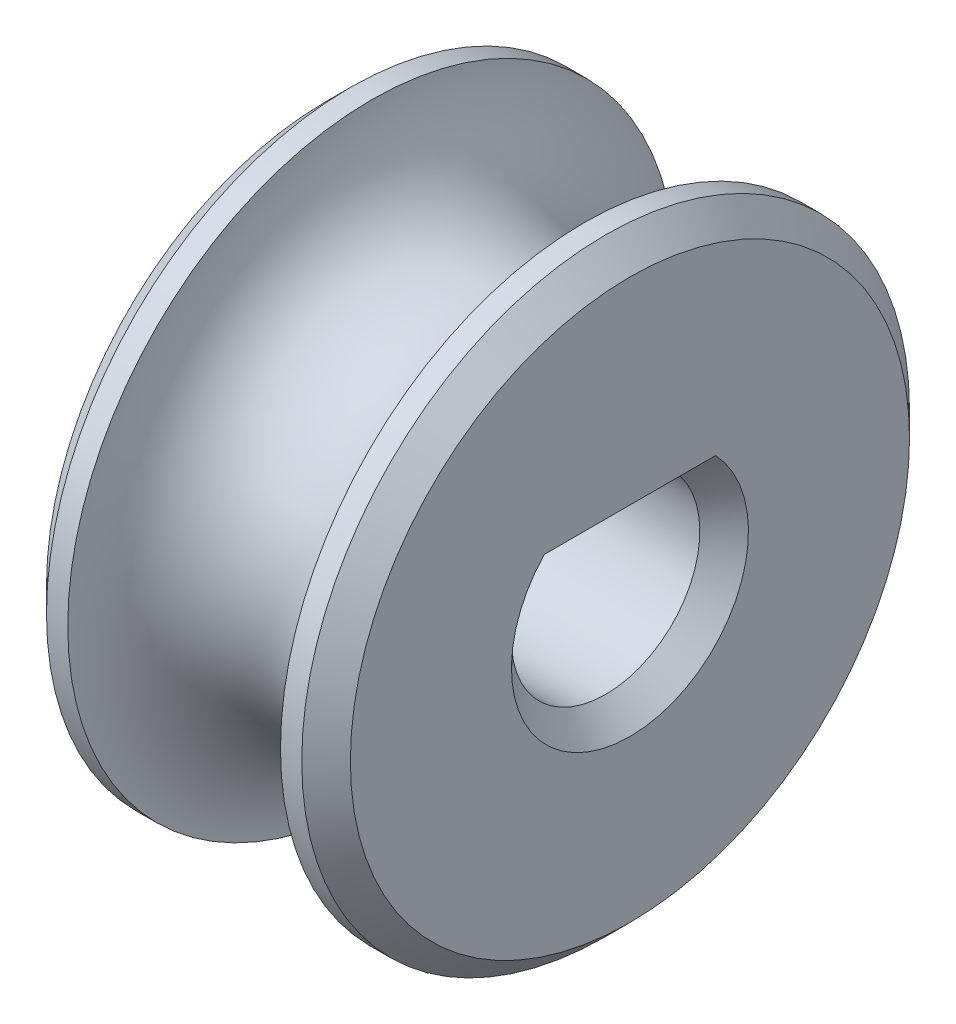
ISO-10303-21;
HEADER;
FILE_DESCRIPTION(('STEP AP214'),'2;1');
FILE_NAME('part.step','',(''),(''),'','','');
FILE_SCHEMA(('AUTOMOTIVE_DESIGN { 1 0 10303 214 1 1 1 1 }'));
ENDSEC;
DATA;
#1=APPLICATION_CONTEXT('core data for automotive mechanical design processes');
#2=APPLICATION_PROTOCOL_DEFINITION('international standard','automotive_design',2000,#1);
#3=PRODUCT_CONTEXT('',#1,'mechanical');
#4=PRODUCT('Part','Part','',(#3));
#5=PRODUCT_RELATED_PRODUCT_CATEGORY('part','',(#4));
#6=PRODUCT_DEFINITION_FORMATION('','',#4);
#7=PRODUCT_DEFINITION_CONTEXT('part definition',#1,'design');
#8=PRODUCT_DEFINITION('design','',#6,#7);
#9=PRODUCT_DEFINITION_SHAPE('','',#8);
#10=(LENGTH_UNIT() NAMED_UNIT(*) SI_UNIT(.MILLI.,.METRE.));
#11=(NAMED_UNIT(*) PLANE_ANGLE_UNIT() SI_UNIT($,.RADIAN.));
#12=(NAMED_UNIT(*) SI_UNIT($,.STERADIAN.) SOLID_ANGLE_UNIT());
#13=UNCERTAINTY_MEASURE_WITH_UNIT(LENGTH_MEASURE(1.E-05),#10,'distance_accuracy_value','');
#14=(GEOMETRIC_REPRESENTATION_CONTEXT(3) GLOBAL_UNCERTAINTY_ASSIGNED_CONTEXT((#13)) GLOBAL_UNIT_ASSIGNED_CONTEXT((#10,
#11,#12)) REPRESENTATION_CONTEXT('',''));
#15=CARTESIAN_POINT('',(0.,0.,0.));
#16=DIRECTION('',(0.,0.,1.));
#17=DIRECTION('',(1.,0.,0.));
#18=AXIS2_PLACEMENT_3D('',#15,#16,#17);
#19=CARTESIAN_POINT('',(2.5,2.5,0.));
#20=DIRECTION('',(-1.,0.,0.));
#21=DIRECTION('',(0.,0.,1.));
#22=AXIS2_PLACEMENT_3D('',#19,#20,#21);
#23=PLANE('',#22);
#24=CARTESIAN_POINT('',(2.5,-2.5,0.));
#25=DIRECTION('',(-1.,0.,0.));
#26=DIRECTION('',(0.,0.,1.));
#27=AXIS2_PLACEMENT_3D('',#24,#25,#26);
#28=CIRCLE('',#27,1.95);
#29=CARTESIAN_POINT('',(2.5,-1.15,-1.40712472794703));
#30=VERTEX_POINT('',#29);
#31=CARTESIAN_POINT('',(2.5,-1.15,1.40712472794703));
#32=VERTEX_POINT('',#31);
#33=EDGE_CURVE('E54',#30,#32,#28,.T.);
#34=ORIENTED_EDGE('',*,*,#33,.T.);
#35=DIRECTION('',(0.,0.,-1.));
#36=VECTOR('',#35,1.);
#37=CARTESIAN_POINT('',(2.5,-1.15,0.));
#38=LINE('',#37,#36);
#39=EDGE_CURVE('E116',#32,#30,#38,.T.);
#40=ORIENTED_EDGE('',*,*,#39,.T.);
#41=EDGE_LOOP('',(#34,#40));
#42=FACE_BOUND('',#41,.T.);
#43=CARTESIAN_POINT('',(2.5,-2.5,0.));
#44=DIRECTION('',(-1.,0.,0.));
#45=DIRECTION('',(0.,0.,1.));
#46=AXIS2_PLACEMENT_3D('',#43,#44,#45);
#47=CIRCLE('',#46,4.6);
#48=CARTESIAN_POINT('',(2.5,-2.5,4.6));
#49=VERTEX_POINT('',#48);
#50=EDGE_CURVE('E112',#49,#49,#47,.F.);
#51=ORIENTED_EDGE('',*,*,#50,.T.);
#52=EDGE_LOOP('',(#51));
#53=FACE_BOUND('',#52,.T.);
#54=ADVANCED_FACE('F33',(#42,#53),#23,.F.);
#55=CARTESIAN_POINT('',(-2.5,-2.5,0.));
#56=DIRECTION('',(-1.,0.,0.));
#57=DIRECTION('',(0.,0.,1.));
#58=AXIS2_PLACEMENT_3D('',#55,#56,#57);
#59=CYLINDRICAL_SURFACE('',#58,5.);
#60=CARTESIAN_POINT('',(2.1,-2.5,0.));
#61=DIRECTION('',(-1.,0.,0.));
#62=DIRECTION('',(0.,0.,1.));
#63=AXIS2_PLACEMENT_3D('',#60,#61,#62);
#64=CIRCLE('',#63,5.);
#65=CARTESIAN_POINT('',(2.1,-2.5,5.));
#66=VERTEX_POINT('',#65);
#67=EDGE_CURVE('E47',#66,#66,#64,.T.);
#68=ORIENTED_EDGE('',*,*,#67,.T.);
#69=EDGE_LOOP('',(#68));
#70=FACE_BOUND('',#69,.T.);
#71=CARTESIAN_POINT('',(1.75,-2.5,0.));
#72=DIRECTION('',(-1.,0.,0.));
#73=DIRECTION('',(0.,0.,1.));
#74=AXIS2_PLACEMENT_3D('',#71,#72,#73);
#75=CIRCLE('',#74,5.);
#76=CARTESIAN_POINT('',(1.75,-2.5,5.));
#77=VERTEX_POINT('',#76);
#78=EDGE_CURVE('E160',#77,#77,#75,.T.);
#79=ORIENTED_EDGE('',*,*,#78,.F.);
#80=EDGE_LOOP('',(#79));
#81=FACE_BOUND('',#80,.T.);
#82=ADVANCED_FACE('F176',(#70,#81),#59,.T.);
#83=CARTESIAN_POINT('',(0.,-2.5,0.));
#84=DIRECTION('',(-1.,0.,0.));
#85=DIRECTION('',(0.,0.,1.));
#86=AXIS2_PLACEMENT_3D('',#83,#84,#85);
#87=TOROIDAL_SURFACE('',#86,5.,1.75);
#88=CARTESIAN_POINT('',(-1.75,-2.5,0.));
#89=DIRECTION('',(-1.,0.,0.));
#90=DIRECTION('',(0.,0.,1.));
#91=AXIS2_PLACEMENT_3D('',#88,#89,#90);
#92=CIRCLE('',#91,5.);
#93=CARTESIAN_POINT('',(-1.75,-2.5,5.));
#94=VERTEX_POINT('',#93);
#95=EDGE_CURVE('E157',#94,#94,#92,.T.);
#96=ORIENTED_EDGE('',*,*,#95,.F.);
#97=EDGE_LOOP('',(#96));
#98=FACE_BOUND('',#97,.T.);
#99=ORIENTED_EDGE('',*,*,#78,.T.);
#100=EDGE_LOOP('',(#99));
#101=FACE_BOUND('',#100,.T.);
#102=ADVANCED_FACE('F180',(#98,#101),#87,.F.);
#103=CARTESIAN_POINT('',(-2.5,-2.5,0.));
#104=DIRECTION('',(-1.,0.,0.));
#105=DIRECTION('',(0.,0.,1.));
#106=AXIS2_PLACEMENT_3D('',#103,#104,#105);
#107=CYLINDRICAL_SURFACE('',#106,5.);
#108=CARTESIAN_POINT('',(-2.1,-2.5,0.));
#109=DIRECTION('',(1.,0.,0.));
#110=DIRECTION('',(0.,0.,-1.));
#111=AXIS2_PLACEMENT_3D('',#108,#109,#110);
#112=CIRCLE('',#111,5.);
#113=CARTESIAN_POINT('',(-2.1,-2.5,-5.));
#114=VERTEX_POINT('',#113);
#115=EDGE_CURVE('E11',#114,#114,#112,.T.);
#116=ORIENTED_EDGE('',*,*,#115,.T.);
#117=EDGE_LOOP('',(#116));
#118=FACE_BOUND('',#117,.T.);
#119=ORIENTED_EDGE('',*,*,#95,.T.);
#120=EDGE_LOOP('',(#119));
#121=FACE_BOUND('',#120,.T.);
#122=ADVANCED_FACE('F187',(#118,#121),#107,.T.);
#123=CARTESIAN_POINT('',(-2.5,2.5,0.));
#124=DIRECTION('',(1.,0.,0.));
#125=DIRECTION('',(0.,0.,-1.));
#126=AXIS2_PLACEMENT_3D('',#123,#124,#125);
#127=PLANE('',#126);
#128=CARTESIAN_POINT('',(-2.5,-2.5,0.));
#129=DIRECTION('',(1.,0.,0.));
#130=DIRECTION('',(0.,0.,-1.));
#131=AXIS2_PLACEMENT_3D('',#128,#129,#130);
#132=CIRCLE('',#131,1.95);
#133=CARTESIAN_POINT('',(-2.5,-1.15,1.40712472794703));
#134=VERTEX_POINT('',#133);
#135=CARTESIAN_POINT('',(-2.5,-1.15,-1.40712472794703));
#136=VERTEX_POINT('',#135);
#137=EDGE_CURVE('E94',#134,#136,#132,.T.);
#138=ORIENTED_EDGE('',*,*,#137,.T.);
#139=DIRECTION('',(0.,0.,1.));
#140=VECTOR('',#139,1.);
#141=CARTESIAN_POINT('',(-2.5,-1.15,0.));
#142=LINE('',#141,#140);
#143=EDGE_CURVE('E86',#136,#134,#142,.T.);
#144=ORIENTED_EDGE('',*,*,#143,.T.);
#145=EDGE_LOOP('',(#138,#144));
#146=FACE_BOUND('',#145,.T.);
#147=CARTESIAN_POINT('',(-2.5,-2.5,0.));
#148=DIRECTION('',(1.,0.,0.));
#149=DIRECTION('',(0.,0.,-1.));
#150=AXIS2_PLACEMENT_3D('',#147,#148,#149);
#151=CIRCLE('',#150,4.6);
#152=CARTESIAN_POINT('',(-2.5,-2.5,-4.6));
#153=VERTEX_POINT('',#152);
#154=EDGE_CURVE('E97',#153,#153,#151,.F.);
#155=ORIENTED_EDGE('',*,*,#154,.T.);
#156=EDGE_LOOP('',(#155));
#157=FACE_BOUND('',#156,.T.);
#158=ADVANCED_FACE('F99',(#146,#157),#127,.F.);
#159=CARTESIAN_POINT('',(-2.5,-2.5,0.));
#160=DIRECTION('',(1.,0.,0.));
#161=DIRECTION('',(0.,0.,-1.));
#162=AXIS2_PLACEMENT_3D('',#159,#160,#161);
#163=CYLINDRICAL_SURFACE('',#162,1.55);
#164=DIRECTION('',(1.,0.,0.));
#165=VECTOR('',#164,1.);
#166=CARTESIAN_POINT('',(-2.5,-1.55,-1.22474487139159));
#167=LINE('',#166,#165);
#168=CARTESIAN_POINT('',(-2.1,-1.55,-1.22474487139159));
#169=VERTEX_POINT('',#168);
#170=CARTESIAN_POINT('',(2.1,-1.55,-1.22474487139159));
#171=VERTEX_POINT('',#170);
#172=EDGE_CURVE('E155',#169,#171,#167,.T.);
#173=ORIENTED_EDGE('',*,*,#172,.F.);
#174=CARTESIAN_POINT('',(-2.1,-2.5,0.));
#175=DIRECTION('',(1.,0.,0.));
#176=DIRECTION('',(0.,0.,-1.));
#177=AXIS2_PLACEMENT_3D('',#174,#175,#176);
#178=CIRCLE('',#177,1.55);
#179=CARTESIAN_POINT('',(-2.1,-1.55,1.22474487139159));
#180=VERTEX_POINT('',#179);
#181=EDGE_CURVE('E110',#169,#180,#178,.F.);
#182=ORIENTED_EDGE('',*,*,#181,.T.);
#183=DIRECTION('',(1.,0.,0.));
#184=VECTOR('',#183,1.);
#185=CARTESIAN_POINT('',(-2.5,-1.55,1.22474487139159));
#186=LINE('',#185,#184);
#187=CARTESIAN_POINT('',(2.1,-1.55,1.22474487139159));
#188=VERTEX_POINT('',#187);
#189=EDGE_CURVE('E154',#180,#188,#186,.T.);
#190=ORIENTED_EDGE('',*,*,#189,.T.);
#191=CARTESIAN_POINT('',(2.1,-2.5,0.));
#192=DIRECTION('',(-1.,0.,0.));
#193=DIRECTION('',(0.,0.,1.));
#194=AXIS2_PLACEMENT_3D('',#191,#192,#193);
#195=CIRCLE('',#194,1.55);
#196=EDGE_CURVE('E108',#188,#171,#195,.F.);
#197=ORIENTED_EDGE('',*,*,#196,.T.);
#198=EDGE_LOOP('',(#173,#182,#190,#197));
#199=FACE_BOUND('',#198,.T.);
#200=ADVANCED_FACE('F156',(#199),#163,.F.);
#201=CARTESIAN_POINT('',(-2.5,-1.55,1.22474487139159));
#202=DIRECTION('',(0.,1.,0.));
#203=DIRECTION('',(0.,0.,1.));
#204=AXIS2_PLACEMENT_3D('',#201,#202,#203);
#205=PLANE('',#204);
#206=ORIENTED_EDGE('',*,*,#189,.F.);
#207=DIRECTION('',(0.,0.,-1.));
#208=VECTOR('',#207,1.);
#209=CARTESIAN_POINT('',(-2.1,-1.55,1.22474487139159));
#210=LINE('',#209,#208);
#211=EDGE_CURVE('E88',#180,#169,#210,.T.);
#212=ORIENTED_EDGE('',*,*,#211,.T.);
#213=ORIENTED_EDGE('',*,*,#172,.T.);
#214=DIRECTION('',(0.,0.,1.));
#215=VECTOR('',#214,1.);
#216=CARTESIAN_POINT('',(2.1,-1.55,1.22474487139159));
#217=LINE('',#216,#215);
#218=EDGE_CURVE('E101',#171,#188,#217,.T.);
#219=ORIENTED_EDGE('',*,*,#218,.T.);
#220=EDGE_LOOP('',(#206,#212,#213,#219));
#221=FACE_BOUND('',#220,.T.);
#222=ADVANCED_FACE('F132',(#221),#205,.F.);
#223=CARTESIAN_POINT('',(-2.5,-2.5,0.));
#224=DIRECTION('',(-1.,0.,0.));
#225=DIRECTION('',(0.,0.,1.));
#226=AXIS2_PLACEMENT_3D('',#223,#224,#225);
#227=CONICAL_SURFACE('',#226,1.95,0.785398163397446);
#228=CARTESIAN_POINT('',(-2.5,-1.15,1.40712472794703));
#229=CARTESIAN_POINT('',(-2.4664649167199,-1.18353508328011,1.3928243637953));
#230=CARTESIAN_POINT('',(-2.43297181193794,-1.21702818806207,1.37832582866577));
#231=CARTESIAN_POINT('',(-2.36608473705395,-1.28391526294605,1.34889541818254));
#232=CARTESIAN_POINT('',(-2.33269075716219,-1.31730924283781,1.3339635873055));
#233=CARTESIAN_POINT('',(-2.26600930448002,-1.38399069551999,1.30362624964026));
#234=CARTESIAN_POINT('',(-2.23272183471923,-1.41727816528077,1.28822072950814));
#235=CARTESIAN_POINT('',(-2.1662664774591,-1.4837335225409,1.25688672638215));
#236=CARTESIAN_POINT('',(-2.1330986025517,-1.5169013974483,1.24095819000798));
#237=CARTESIAN_POINT('',(-2.1,-1.55,1.22474487139159));
#238=B_SPLINE_CURVE_WITH_KNOTS('',3,(#228,#229,#230,#231,#232,#233,#234,#235,#236,#237),
.UNSPECIFIED.,.F.,.F.,(4,2,2,2,4),(0.,0.148604728991569,0.297194257686436,0.445787976017482,
0.594396907611626),.UNSPECIFIED.);
#239=EDGE_CURVE('E82',#180,#134,#238,.F.);
#240=ORIENTED_EDGE('',*,*,#239,.F.);
#241=ORIENTED_EDGE('',*,*,#181,.F.);
#242=CARTESIAN_POINT('',(-2.1,-1.55,-1.22474487139159));
#243=CARTESIAN_POINT('',(-2.1330986025517,-1.5169013974483,-1.24095819000798));
#244=CARTESIAN_POINT('',(-2.1662664774591,-1.4837335225409,-1.25688672638215));
#245=CARTESIAN_POINT('',(-2.23272183471923,-1.41727816528077,-1.28822072950814));
#246=CARTESIAN_POINT('',(-2.26600930448002,-1.38399069551999,-1.30362624964026));
#247=CARTESIAN_POINT('',(-2.33269075716219,-1.31730924283781,-1.3339635873055));
#248=CARTESIAN_POINT('',(-2.36608473705395,-1.28391526294605,-1.34889541818254));
#249=CARTESIAN_POINT('',(-2.43297181193794,-1.21702818806207,-1.37832582866577));
#250=CARTESIAN_POINT('',(-2.4664649167199,-1.18353508328011,-1.3928243637953));
#251=CARTESIAN_POINT('',(-2.5,-1.15,-1.40712472794703));
#252=B_SPLINE_CURVE_WITH_KNOTS('',3,(#242,#243,#244,#245,#246,#247,#248,#249,#250,#251),
.UNSPECIFIED.,.F.,.F.,(4,2,2,2,4),(0.,0.148608931594143,0.29720264992519,0.445792178620056,
0.594396907611626),.UNSPECIFIED.);
#253=EDGE_CURVE('E91',#136,#169,#252,.F.);
#254=ORIENTED_EDGE('',*,*,#253,.F.);
#255=ORIENTED_EDGE('',*,*,#137,.F.);
#256=EDGE_LOOP('',(#240,#241,#254,#255));
#257=FACE_BOUND('',#256,.T.);
#258=ADVANCED_FACE('F95',(#257),#227,.F.);
#259=CARTESIAN_POINT('',(-2.5,-1.15,0.));
#260=DIRECTION('',(0.707106781186546,0.707106781186549,0.));
#261=DIRECTION('',(0.,0.,1.));
#262=AXIS2_PLACEMENT_3D('',#259,#260,#261);
#263=PLANE('',#262);
#264=ORIENTED_EDGE('',*,*,#253,.T.);
#265=ORIENTED_EDGE('',*,*,#211,.F.);
#266=ORIENTED_EDGE('',*,*,#239,.T.);
#267=ORIENTED_EDGE('',*,*,#143,.F.);
#268=EDGE_LOOP('',(#264,#265,#266,#267));
#269=FACE_BOUND('',#268,.T.);
#270=ADVANCED_FACE('F84',(#269),#263,.F.);
#271=CARTESIAN_POINT('',(2.1,-2.5,0.));
#272=DIRECTION('',(1.,0.,0.));
#273=DIRECTION('',(0.,0.,-1.));
#274=AXIS2_PLACEMENT_3D('',#271,#272,#273);
#275=CONICAL_SURFACE('',#274,1.55,0.785398163397451);
#276=CARTESIAN_POINT('',(2.1,-1.55,1.22474487139159));
#277=CARTESIAN_POINT('',(2.1330986025517,-1.5169013974483,1.24095819000798));
#278=CARTESIAN_POINT('',(2.1662664774591,-1.4837335225409,1.25688672638215));
#279=CARTESIAN_POINT('',(2.23272183471923,-1.41727816528077,1.28822072950814));
#280=CARTESIAN_POINT('',(2.26600930448002,-1.38399069551999,1.30362624964026));
#281=CARTESIAN_POINT('',(2.33269075716219,-1.31730924283781,1.3339635873055));
#282=CARTESIAN_POINT('',(2.36608473705395,-1.28391526294605,1.34889541818254));
#283=CARTESIAN_POINT('',(2.43297181193794,-1.21702818806207,1.37832582866577));
#284=CARTESIAN_POINT('',(2.4664649167199,-1.18353508328011,1.3928243637953));
#285=CARTESIAN_POINT('',(2.5,-1.15,1.40712472794703));
#286=B_SPLINE_CURVE_WITH_KNOTS('',3,(#276,#277,#278,#279,#280,#281,#282,#283,#284,#285),
.UNSPECIFIED.,.F.,.F.,(4,2,2,2,4),(0.,0.148608931594142,0.297202649925187,0.445792178620052,
0.59439690761162),.UNSPECIFIED.);
#287=EDGE_CURVE('E141',#32,#188,#286,.F.);
#288=ORIENTED_EDGE('',*,*,#287,.F.);
#289=ORIENTED_EDGE('',*,*,#33,.F.);
#290=CARTESIAN_POINT('',(2.5,-1.15,-1.40712472794703));
#291=CARTESIAN_POINT('',(2.4664649167199,-1.18353508328011,-1.3928243637953));
#292=CARTESIAN_POINT('',(2.43297181193794,-1.21702818806207,-1.37832582866577));
#293=CARTESIAN_POINT('',(2.36608473705395,-1.28391526294605,-1.34889541818254));
#294=CARTESIAN_POINT('',(2.33269075716219,-1.31730924283781,-1.3339635873055));
#295=CARTESIAN_POINT('',(2.26600930448002,-1.38399069551999,-1.30362624964026));
#296=CARTESIAN_POINT('',(2.23272183471923,-1.41727816528077,-1.28822072950814));
#297=CARTESIAN_POINT('',(2.1662664774591,-1.4837335225409,-1.25688672638215));
#298=CARTESIAN_POINT('',(2.1330986025517,-1.5169013974483,-1.24095819000798));
#299=CARTESIAN_POINT('',(2.1,-1.55,-1.22474487139159));
#300=B_SPLINE_CURVE_WITH_KNOTS('',3,(#290,#291,#292,#293,#294,#295,#296,#297,#298,#299),
.UNSPECIFIED.,.F.,.F.,(4,2,2,2,4),(0.,0.148604728991568,0.297194257686434,0.445787976017478,
0.59439690761162),.UNSPECIFIED.);
#301=EDGE_CURVE('E37',#171,#30,#300,.F.);
#302=ORIENTED_EDGE('',*,*,#301,.F.);
#303=ORIENTED_EDGE('',*,*,#196,.F.);
#304=EDGE_LOOP('',(#288,#289,#302,#303));
#305=FACE_BOUND('',#304,.T.);
#306=ADVANCED_FACE('F138',(#305),#275,.F.);
#307=CARTESIAN_POINT('',(2.1,-1.55,1.22474487139159));
#308=DIRECTION('',(-0.70710678118655,0.707106781186545,0.));
#309=DIRECTION('',(0.,0.,1.));
#310=AXIS2_PLACEMENT_3D('',#307,#308,#309);
#311=PLANE('',#310);
#312=ORIENTED_EDGE('',*,*,#301,.T.);
#313=ORIENTED_EDGE('',*,*,#39,.F.);
#314=ORIENTED_EDGE('',*,*,#287,.T.);
#315=ORIENTED_EDGE('',*,*,#218,.F.);
#316=EDGE_LOOP('',(#312,#313,#314,#315));
#317=FACE_BOUND('',#316,.T.);
#318=ADVANCED_FACE('F133',(#317),#311,.F.);
#319=CARTESIAN_POINT('',(2.1,-2.5,0.));
#320=DIRECTION('',(-1.,0.,0.));
#321=DIRECTION('',(0.,0.,1.));
#322=AXIS2_PLACEMENT_3D('',#319,#320,#321);
#323=CONICAL_SURFACE('',#322,5.,0.785398163397449);
#324=ORIENTED_EDGE('',*,*,#50,.F.);
#325=EDGE_LOOP('',(#324));
#326=FACE_BOUND('',#325,.T.);
#327=ORIENTED_EDGE('',*,*,#67,.F.);
#328=EDGE_LOOP('',(#327));
#329=FACE_BOUND('',#328,.T.);
#330=ADVANCED_FACE('F137',(#326,#329),#323,.T.);
#331=CARTESIAN_POINT('',(-2.5,-2.5,0.));
#332=DIRECTION('',(1.,0.,0.));
#333=DIRECTION('',(0.,0.,-1.));
#334=AXIS2_PLACEMENT_3D('',#331,#332,#333);
#335=CONICAL_SURFACE('',#334,4.6,0.785398163397445);
#336=ORIENTED_EDGE('',*,*,#115,.F.);
#337=EDGE_LOOP('',(#336));
#338=FACE_BOUND('',#337,.T.);
#339=ORIENTED_EDGE('',*,*,#154,.F.);
#340=EDGE_LOOP('',(#339));
#341=FACE_BOUND('',#340,.T.);
#342=ADVANCED_FACE('F35',(#338,#341),#335,.T.);
#343=CLOSED_SHELL('',(#54,#82,#102,#122,#158,#200,#222,#258,#270,#306,#318,#330,#342));
#344=MANIFOLD_SOLID_BREP('B2',#343);
#345=ADVANCED_BREP_SHAPE_REPRESENTATION('',(#18,#344),#14);
#346=SHAPE_DEFINITION_REPRESENTATION(#9,#345);
ENDSEC;
END-ISO-10303-21;
